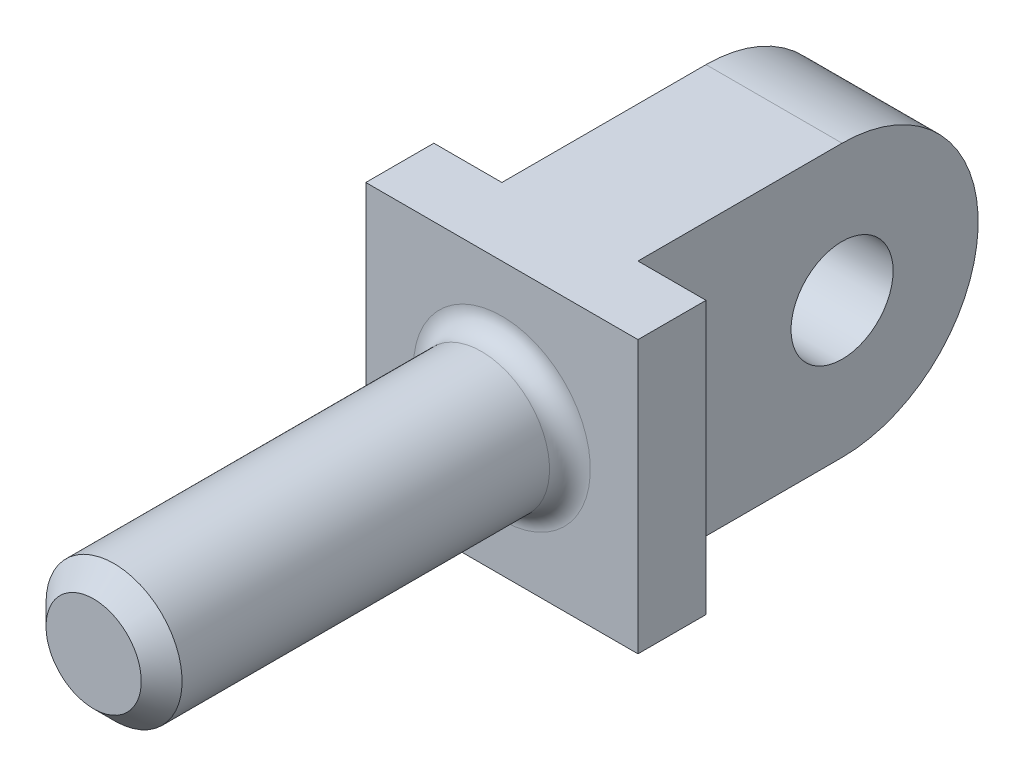
ISO-10303-21;
HEADER;
FILE_DESCRIPTION(('STEP AP214'),'2;1');
FILE_NAME('part.step','',(''),(''),'','','');
FILE_SCHEMA(('AUTOMOTIVE_DESIGN { 1 0 10303 214 1 1 1 1 }'));
ENDSEC;
DATA;
#1=APPLICATION_CONTEXT('core data for automotive mechanical design processes');
#2=APPLICATION_PROTOCOL_DEFINITION('international standard','automotive_design',2000,#1);
#3=PRODUCT_CONTEXT('',#1,'mechanical');
#4=PRODUCT('Part','Part','',(#3));
#5=PRODUCT_RELATED_PRODUCT_CATEGORY('part','',(#4));
#6=PRODUCT_DEFINITION_FORMATION('','',#4);
#7=PRODUCT_DEFINITION_CONTEXT('part definition',#1,'design');
#8=PRODUCT_DEFINITION('design','',#6,#7);
#9=PRODUCT_DEFINITION_SHAPE('','',#8);
#10=(LENGTH_UNIT() NAMED_UNIT(*) SI_UNIT(.MILLI.,.METRE.));
#11=(NAMED_UNIT(*) PLANE_ANGLE_UNIT() SI_UNIT($,.RADIAN.));
#12=(NAMED_UNIT(*) SI_UNIT($,.STERADIAN.) SOLID_ANGLE_UNIT());
#13=UNCERTAINTY_MEASURE_WITH_UNIT(LENGTH_MEASURE(1.E-05),#10,'distance_accuracy_value','');
#14=(GEOMETRIC_REPRESENTATION_CONTEXT(3) GLOBAL_UNCERTAINTY_ASSIGNED_CONTEXT((#13)) GLOBAL_UNIT_ASSIGNED_CONTEXT((#10,
#11,#12)) REPRESENTATION_CONTEXT('',''));
#15=CARTESIAN_POINT('',(0.,0.,0.));
#16=DIRECTION('',(0.,0.,1.));
#17=DIRECTION('',(1.,0.,0.));
#18=AXIS2_PLACEMENT_3D('',#15,#16,#17);
#19=CARTESIAN_POINT('',(0.,0.,-12.7));
#20=DIRECTION('',(0.,0.,-1.));
#21=DIRECTION('',(-1.,0.,0.));
#22=AXIS2_PLACEMENT_3D('',#19,#20,#21);
#23=PLANE('',#22);
#24=DIRECTION('',(-1.,0.,0.));
#25=VECTOR('',#24,1.);
#26=CARTESIAN_POINT('',(-25.4,25.4,-12.7));
#27=LINE('',#26,#25);
#28=CARTESIAN_POINT('',(-12.7,25.4,-12.7));
#29=VERTEX_POINT('',#28);
#30=CARTESIAN_POINT('',(-25.4,25.4,-12.7));
#31=VERTEX_POINT('',#30);
#32=EDGE_CURVE('E2329',#29,#31,#27,.T.);
#33=ORIENTED_EDGE('',*,*,#32,.F.);
#34=DIRECTION('',(0.,-1.,0.));
#35=VECTOR('',#34,1.);
#36=CARTESIAN_POINT('',(-12.7,25.4,-12.7));
#37=LINE('',#36,#35);
#38=CARTESIAN_POINT('',(-12.7,-25.4,-12.7));
#39=VERTEX_POINT('',#38);
#40=EDGE_CURVE('E2425',#29,#39,#37,.T.);
#41=ORIENTED_EDGE('',*,*,#40,.T.);
#42=DIRECTION('',(1.,0.,0.));
#43=VECTOR('',#42,1.);
#44=CARTESIAN_POINT('',(-25.4,-25.4,-12.7));
#45=LINE('',#44,#43);
#46=CARTESIAN_POINT('',(-25.4,-25.4,-12.7));
#47=VERTEX_POINT('',#46);
#48=EDGE_CURVE('E2389',#47,#39,#45,.T.);
#49=ORIENTED_EDGE('',*,*,#48,.F.);
#50=DIRECTION('',(0.,-1.,0.));
#51=VECTOR('',#50,1.);
#52=CARTESIAN_POINT('',(-25.4,-25.4,-12.7));
#53=LINE('',#52,#51);
#54=EDGE_CURVE('E2386',#31,#47,#53,.T.);
#55=ORIENTED_EDGE('',*,*,#54,.F.);
#56=EDGE_LOOP('',(#33,#41,#49,#55));
#57=FACE_BOUND('',#56,.T.);
#58=ADVANCED_FACE('F2314',(#57),#23,.T.);
#59=CARTESIAN_POINT('',(25.4,-25.4,-12.7));
#60=DIRECTION('',(1.,0.,0.));
#61=DIRECTION('',(0.,0.,-1.));
#62=AXIS2_PLACEMENT_3D('',#59,#60,#61);
#63=PLANE('',#62);
#64=DIRECTION('',(0.,1.,0.));
#65=VECTOR('',#64,1.);
#66=CARTESIAN_POINT('',(25.4,-25.4,0.));
#67=LINE('',#66,#65);
#68=CARTESIAN_POINT('',(25.4,-25.4,0.));
#69=VERTEX_POINT('',#68);
#70=CARTESIAN_POINT('',(25.4,25.4,0.));
#71=VERTEX_POINT('',#70);
#72=EDGE_CURVE('E2437',#69,#71,#67,.T.);
#73=ORIENTED_EDGE('',*,*,#72,.F.);
#74=DIRECTION('',(0.,0.,1.));
#75=VECTOR('',#74,1.);
#76=CARTESIAN_POINT('',(25.4,-25.4,-12.7));
#77=LINE('',#76,#75);
#78=CARTESIAN_POINT('',(25.4,-25.4,-12.7));
#79=VERTEX_POINT('',#78);
#80=EDGE_CURVE('E2463',#79,#69,#77,.T.);
#81=ORIENTED_EDGE('',*,*,#80,.F.);
#82=DIRECTION('',(0.,1.,0.));
#83=VECTOR('',#82,1.);
#84=CARTESIAN_POINT('',(25.4,-25.4,-12.7));
#85=LINE('',#84,#83);
#86=CARTESIAN_POINT('',(25.4,25.4,-12.7));
#87=VERTEX_POINT('',#86);
#88=EDGE_CURVE('E2385',#79,#87,#85,.T.);
#89=ORIENTED_EDGE('',*,*,#88,.T.);
#90=DIRECTION('',(0.,0.,1.));
#91=VECTOR('',#90,1.);
#92=CARTESIAN_POINT('',(25.4,25.4,-12.7));
#93=LINE('',#92,#91);
#94=EDGE_CURVE('E2448',#87,#71,#93,.T.);
#95=ORIENTED_EDGE('',*,*,#94,.T.);
#96=EDGE_LOOP('',(#73,#81,#89,#95));
#97=FACE_BOUND('',#96,.T.);
#98=ADVANCED_FACE('F2498',(#97),#63,.T.);
#99=CARTESIAN_POINT('',(-25.4,-25.4,-12.7));
#100=DIRECTION('',(0.,-1.,0.));
#101=DIRECTION('',(0.,0.,-1.));
#102=AXIS2_PLACEMENT_3D('',#99,#100,#101);
#103=PLANE('',#102);
#104=DIRECTION('',(1.,0.,0.));
#105=VECTOR('',#104,1.);
#106=CARTESIAN_POINT('',(-25.4,-25.4,0.));
#107=LINE('',#106,#105);
#108=CARTESIAN_POINT('',(-25.4,-25.4,0.));
#109=VERTEX_POINT('',#108);
#110=EDGE_CURVE('E2439',#109,#69,#107,.T.);
#111=ORIENTED_EDGE('',*,*,#110,.F.);
#112=DIRECTION('',(0.,0.,1.));
#113=VECTOR('',#112,1.);
#114=CARTESIAN_POINT('',(-25.4,-25.4,-12.7));
#115=LINE('',#114,#113);
#116=EDGE_CURVE('E2470',#47,#109,#115,.T.);
#117=ORIENTED_EDGE('',*,*,#116,.F.);
#118=ORIENTED_EDGE('',*,*,#48,.T.);
#119=DIRECTION('',(0.,0.,-1.));
#120=VECTOR('',#119,1.);
#121=CARTESIAN_POINT('',(-12.7,-25.4,-12.7));
#122=LINE('',#121,#120);
#123=CARTESIAN_POINT('',(-12.7,-25.4,-50.8));
#124=VERTEX_POINT('',#123);
#125=EDGE_CURVE('E2423',#39,#124,#122,.T.);
#126=ORIENTED_EDGE('',*,*,#125,.T.);
#127=DIRECTION('',(-1.,0.,0.));
#128=VECTOR('',#127,1.);
#129=CARTESIAN_POINT('',(12.7,-25.4,-50.8));
#130=LINE('',#129,#128);
#131=CARTESIAN_POINT('',(12.7,-25.4,-50.8));
#132=VERTEX_POINT('',#131);
#133=EDGE_CURVE('E2394',#132,#124,#130,.T.);
#134=ORIENTED_EDGE('',*,*,#133,.F.);
#135=DIRECTION('',(0.,0.,-1.));
#136=VECTOR('',#135,1.);
#137=CARTESIAN_POINT('',(12.7,-25.4,-12.7));
#138=LINE('',#137,#136);
#139=CARTESIAN_POINT('',(12.7,-25.4,-12.7));
#140=VERTEX_POINT('',#139);
#141=EDGE_CURVE('E2387',#140,#132,#138,.T.);
#142=ORIENTED_EDGE('',*,*,#141,.F.);
#143=EDGE_CURVE('E2378',#140,#79,#45,.T.);
#144=ORIENTED_EDGE('',*,*,#143,.T.);
#145=ORIENTED_EDGE('',*,*,#80,.T.);
#146=EDGE_LOOP('',(#111,#117,#118,#126,#134,#142,#144,#145));
#147=FACE_BOUND('',#146,.T.);
#148=ADVANCED_FACE('F2395',(#147),#103,.T.);
#149=CARTESIAN_POINT('',(-25.4,-25.4,-12.7));
#150=DIRECTION('',(-1.,0.,0.));
#151=DIRECTION('',(0.,0.,1.));
#152=AXIS2_PLACEMENT_3D('',#149,#150,#151);
#153=PLANE('',#152);
#154=DIRECTION('',(0.,-1.,0.));
#155=VECTOR('',#154,1.);
#156=CARTESIAN_POINT('',(-25.4,-25.4,0.));
#157=LINE('',#156,#155);
#158=CARTESIAN_POINT('',(-25.4,25.4,0.));
#159=VERTEX_POINT('',#158);
#160=EDGE_CURVE('E2458',#159,#109,#157,.T.);
#161=ORIENTED_EDGE('',*,*,#160,.F.);
#162=DIRECTION('',(0.,0.,1.));
#163=VECTOR('',#162,1.);
#164=CARTESIAN_POINT('',(-25.4,25.4,-12.7));
#165=LINE('',#164,#163);
#166=EDGE_CURVE('E2469',#31,#159,#165,.T.);
#167=ORIENTED_EDGE('',*,*,#166,.F.);
#168=ORIENTED_EDGE('',*,*,#54,.T.);
#169=ORIENTED_EDGE('',*,*,#116,.T.);
#170=EDGE_LOOP('',(#161,#167,#168,#169));
#171=FACE_BOUND('',#170,.T.);
#172=ADVANCED_FACE('F2520',(#171),#153,.T.);
#173=CARTESIAN_POINT('',(-25.4,25.4,-12.7));
#174=DIRECTION('',(0.,1.,0.));
#175=DIRECTION('',(0.,0.,1.));
#176=AXIS2_PLACEMENT_3D('',#173,#174,#175);
#177=PLANE('',#176);
#178=DIRECTION('',(-1.,0.,0.));
#179=VECTOR('',#178,1.);
#180=CARTESIAN_POINT('',(-25.4,25.4,0.));
#181=LINE('',#180,#179);
#182=EDGE_CURVE('E2452',#71,#159,#181,.T.);
#183=ORIENTED_EDGE('',*,*,#182,.F.);
#184=ORIENTED_EDGE('',*,*,#94,.F.);
#185=CARTESIAN_POINT('',(12.7,25.4,-12.7));
#186=VERTEX_POINT('',#185);
#187=EDGE_CURVE('E2438',#87,#186,#27,.T.);
#188=ORIENTED_EDGE('',*,*,#187,.T.);
#189=DIRECTION('',(0.,0.,1.));
#190=VECTOR('',#189,1.);
#191=CARTESIAN_POINT('',(12.7,25.4,-12.7));
#192=LINE('',#191,#190);
#193=CARTESIAN_POINT('',(12.7,25.4,-50.8));
#194=VERTEX_POINT('',#193);
#195=EDGE_CURVE('E2404',#194,#186,#192,.T.);
#196=ORIENTED_EDGE('',*,*,#195,.F.);
#197=DIRECTION('',(-1.,0.,0.));
#198=VECTOR('',#197,1.);
#199=CARTESIAN_POINT('',(12.7,25.4,-50.8));
#200=LINE('',#199,#198);
#201=CARTESIAN_POINT('',(-12.7,25.4,-50.8));
#202=VERTEX_POINT('',#201);
#203=EDGE_CURVE('E2422',#194,#202,#200,.T.);
#204=ORIENTED_EDGE('',*,*,#203,.T.);
#205=DIRECTION('',(0.,0.,1.));
#206=VECTOR('',#205,1.);
#207=CARTESIAN_POINT('',(-12.7,25.4,-12.7));
#208=LINE('',#207,#206);
#209=EDGE_CURVE('E2406',#202,#29,#208,.T.);
#210=ORIENTED_EDGE('',*,*,#209,.T.);
#211=ORIENTED_EDGE('',*,*,#32,.T.);
#212=ORIENTED_EDGE('',*,*,#166,.T.);
#213=EDGE_LOOP('',(#183,#184,#188,#196,#204,#210,#211,#212));
#214=FACE_BOUND('',#213,.T.);
#215=ADVANCED_FACE('F2509',(#214),#177,.T.);
#216=DIRECTION('',(0.,-1.,0.));
#217=VECTOR('',#216,1.);
#218=CARTESIAN_POINT('',(12.7,25.4,-12.7));
#219=LINE('',#218,#217);
#220=EDGE_CURVE('E2340',#186,#140,#219,.T.);
#221=ORIENTED_EDGE('',*,*,#220,.F.);
#222=ORIENTED_EDGE('',*,*,#187,.F.);
#223=ORIENTED_EDGE('',*,*,#88,.F.);
#224=ORIENTED_EDGE('',*,*,#143,.F.);
#225=EDGE_LOOP('',(#221,#222,#223,#224));
#226=FACE_BOUND('',#225,.T.);
#227=ADVANCED_FACE('F2379',(#226),#23,.T.);
#228=CARTESIAN_POINT('',(0.,0.,0.));
#229=DIRECTION('',(0.,0.,-1.));
#230=DIRECTION('',(-1.,0.,0.));
#231=AXIS2_PLACEMENT_3D('',#228,#229,#230);
#232=PLANE('',#231);
#233=CARTESIAN_POINT('',(0.,0.,0.));
#234=DIRECTION('',(0.,0.,-1.));
#235=DIRECTION('',(-1.,0.,0.));
#236=AXIS2_PLACEMENT_3D('',#233,#234,#235);
#237=CIRCLE('',#236,16.51);
#238=CARTESIAN_POINT('',(-16.51,0.,0.));
#239=VERTEX_POINT('',#238);
#240=EDGE_CURVE('E2479',#239,#239,#237,.T.);
#241=ORIENTED_EDGE('',*,*,#240,.T.);
#242=EDGE_LOOP('',(#241));
#243=FACE_BOUND('',#242,.T.);
#244=ORIENTED_EDGE('',*,*,#72,.T.);
#245=ORIENTED_EDGE('',*,*,#182,.T.);
#246=ORIENTED_EDGE('',*,*,#160,.T.);
#247=ORIENTED_EDGE('',*,*,#110,.T.);
#248=EDGE_LOOP('',(#244,#245,#246,#247));
#249=FACE_BOUND('',#248,.T.);
#250=ADVANCED_FACE('F2510',(#243,#249),#232,.F.);
#251=CARTESIAN_POINT('',(0.,0.,76.2));
#252=DIRECTION('',(0.,0.,-1.));
#253=DIRECTION('',(-1.,0.,0.));
#254=AXIS2_PLACEMENT_3D('',#251,#252,#253);
#255=CYLINDRICAL_SURFACE('',#254,12.7);
#256=CARTESIAN_POINT('',(0.,0.,72.3900000000001));
#257=DIRECTION('',(0.,0.,1.));
#258=DIRECTION('',(1.,0.,0.));
#259=AXIS2_PLACEMENT_3D('',#256,#257,#258);
#260=CIRCLE('',#259,12.7);
#261=CARTESIAN_POINT('',(-12.7,0.,72.3900000000001));
#262=VERTEX_POINT('',#261);
#263=EDGE_CURVE('E12',#262,#262,#260,.F.);
#264=CARTESIAN_POINT('',(0.,0.,3.80999999999999));
#265=DIRECTION('',(0.,0.,-1.));
#266=DIRECTION('',(-1.,0.,0.));
#267=AXIS2_PLACEMENT_3D('',#264,#265,#266);
#268=CIRCLE('',#267,12.7);
#269=CARTESIAN_POINT('',(-12.7,0.,3.81000000000001));
#270=VERTEX_POINT('',#269);
#271=EDGE_CURVE('E2466',#270,#270,#268,.F.);
#272=CARTESIAN_POINT('',(-12.7,0.,72.3900000000001));
#273=CARTESIAN_POINT('',(-12.7,0.,71.6756250000001));
#274=CARTESIAN_POINT('',(-12.7,0.,70.9612500000001));
#275=CARTESIAN_POINT('',(-12.7,0.,69.5325000000001));
#276=CARTESIAN_POINT('',(-12.7,0.,68.8181250000001));
#277=CARTESIAN_POINT('',(-12.7,0.,67.3893750000001));
#278=CARTESIAN_POINT('',(-12.7,0.,66.6750000000001));
#279=CARTESIAN_POINT('',(-12.7,0.,65.2462500000001));
#280=CARTESIAN_POINT('',(-12.7,0.,64.5318750000001));
#281=CARTESIAN_POINT('',(-12.7,0.,63.1031250000001));
#282=CARTESIAN_POINT('',(-12.7,0.,62.3887500000001));
#283=CARTESIAN_POINT('',(-12.7,0.,60.9600000000001));
#284=CARTESIAN_POINT('',(-12.7,0.,60.2456250000001));
#285=CARTESIAN_POINT('',(-12.7,0.,58.8168750000001));
#286=CARTESIAN_POINT('',(-12.7,0.,58.1025000000001));
#287=CARTESIAN_POINT('',(-12.7,0.,56.6737500000001));
#288=CARTESIAN_POINT('',(-12.7,0.,55.9593750000001));
#289=CARTESIAN_POINT('',(-12.7,0.,54.5306250000001));
#290=CARTESIAN_POINT('',(-12.7,0.,53.8162500000001));
#291=CARTESIAN_POINT('',(-12.7,0.,52.3875000000001));
#292=CARTESIAN_POINT('',(-12.7,0.,51.673125));
#293=CARTESIAN_POINT('',(-12.7,0.,50.244375));
#294=CARTESIAN_POINT('',(-12.7,0.,49.53));
#295=CARTESIAN_POINT('',(-12.7,0.,48.1012500000001));
#296=CARTESIAN_POINT('',(-12.7,0.,47.386875));
#297=CARTESIAN_POINT('',(-12.7,0.,45.958125));
#298=CARTESIAN_POINT('',(-12.7,0.,45.24375));
#299=CARTESIAN_POINT('',(-12.7,0.,43.815));
#300=CARTESIAN_POINT('',(-12.7,0.,43.100625));
#301=CARTESIAN_POINT('',(-12.7,0.,41.671875));
#302=CARTESIAN_POINT('',(-12.7,0.,40.9575));
#303=CARTESIAN_POINT('',(-12.7,0.,39.52875));
#304=CARTESIAN_POINT('',(-12.7,0.,38.814375));
#305=CARTESIAN_POINT('',(-12.7,0.,37.385625));
#306=CARTESIAN_POINT('',(-12.7,0.,36.67125));
#307=CARTESIAN_POINT('',(-12.7,0.,35.2425));
#308=CARTESIAN_POINT('',(-12.7,0.,34.528125));
#309=CARTESIAN_POINT('',(-12.7,0.,33.099375));
#310=CARTESIAN_POINT('',(-12.7,0.,32.385));
#311=CARTESIAN_POINT('',(-12.7,0.,30.95625));
#312=CARTESIAN_POINT('',(-12.7,0.,30.241875));
#313=CARTESIAN_POINT('',(-12.7,0.,28.813125));
#314=CARTESIAN_POINT('',(-12.7,0.,28.09875));
#315=CARTESIAN_POINT('',(-12.7,0.,26.67));
#316=CARTESIAN_POINT('',(-12.7,0.,25.955625));
#317=CARTESIAN_POINT('',(-12.7,0.,24.526875));
#318=CARTESIAN_POINT('',(-12.7,0.,23.8125));
#319=CARTESIAN_POINT('',(-12.7,0.,22.38375));
#320=CARTESIAN_POINT('',(-12.7,0.,21.669375));
#321=CARTESIAN_POINT('',(-12.7,0.,20.240625));
#322=CARTESIAN_POINT('',(-12.7,0.,19.52625));
#323=CARTESIAN_POINT('',(-12.7,0.,18.0975));
#324=CARTESIAN_POINT('',(-12.7,0.,17.383125));
#325=CARTESIAN_POINT('',(-12.7,0.,15.954375));
#326=CARTESIAN_POINT('',(-12.7,0.,15.24));
#327=CARTESIAN_POINT('',(-12.7,0.,13.81125));
#328=CARTESIAN_POINT('',(-12.7,0.,13.096875));
#329=CARTESIAN_POINT('',(-12.7,0.,11.668125));
#330=CARTESIAN_POINT('',(-12.7,0.,10.95375));
#331=CARTESIAN_POINT('',(-12.7,0.,9.52500000000001));
#332=CARTESIAN_POINT('',(-12.7,0.,8.810625));
#333=CARTESIAN_POINT('',(-12.7,0.,7.381875));
#334=CARTESIAN_POINT('',(-12.7,0.,6.6675));
#335=CARTESIAN_POINT('',(-12.7,0.,5.23875000000001));
#336=CARTESIAN_POINT('',(-12.7,0.,4.52437500000001));
#337=CARTESIAN_POINT('',(-12.7,0.,3.81000000000001));
#338=B_SPLINE_CURVE_WITH_KNOTS('',3,(#272,#273,#274,#275,#276,#277,#278,#279,#280,#281,#282,
#283,#284,#285,#286,#287,#288,#289,#290,#291,#292,#293,#294,#295,#296,#297,#298,#299,#300,#301,
#302,#303,#304,#305,#306,#307,#308,#309,#310,#311,#312,#313,#314,#315,#316,#317,#318,#319,#320,
#321,#322,#323,#324,#325,#326,#327,#328,#329,#330,#331,#332,#333,#334,#335,#336,#337),
.UNSPECIFIED.,.F.,.F.,(4,2,2,2,2,2,2,2,2,2,2,2,2,2,2,2,2,2,2,2,2,2,2,2,2,2,2,2,2,2,2,2,4),(0.,
2.14312500000001,4.28625000000001,6.42937500000001,8.57250000000001,10.715625,12.85875,
15.001875,17.145,19.288125,21.43125,23.574375,25.7175,27.860625,30.00375,32.146875,34.29,
36.433125,38.5762500000001,40.719375,42.8625000000001,45.0056250000001,47.1487500000001,
49.2918750000001,51.4350000000001,53.5781250000001,55.7212500000001,57.8643750000001,
60.0075000000001,62.1506250000001,64.2937500000001,66.4368750000001,68.5800000000001),.UNSPECIFIED.);
#339=EDGE_CURVE('BSEAM2512',#262,#270,#338,.T.);
#340=ORIENTED_EDGE('',*,*,#263,.T.);
#341=ORIENTED_EDGE('',*,*,#271,.T.);
#342=ORIENTED_EDGE('',*,*,#339,.T.);
#343=ORIENTED_EDGE('',*,*,#339,.F.);
#344=EDGE_LOOP('',(#340,#342,#341,#343));
#345=FACE_BOUND('',#344,.T.);
#346=ADVANCED_FACE('F2512',(#345),#255,.T.);
#347=CARTESIAN_POINT('',(0.,0.,76.2));
#348=DIRECTION('',(0.,0.,1.));
#349=DIRECTION('',(1.,0.,0.));
#350=AXIS2_PLACEMENT_3D('',#347,#348,#349);
#351=PLANE('',#350);
#352=CARTESIAN_POINT('',(0.,0.,76.2));
#353=DIRECTION('',(0.,0.,1.));
#354=DIRECTION('',(1.,0.,0.));
#355=AXIS2_PLACEMENT_3D('',#352,#353,#354);
#356=CIRCLE('',#355,8.89000000000009);
#357=CARTESIAN_POINT('',(-8.8900000000001,0.,76.2));
#358=VERTEX_POINT('',#357);
#359=EDGE_CURVE('E2325',#358,#358,#356,.T.);
#360=ORIENTED_EDGE('',*,*,#359,.T.);
#361=EDGE_LOOP('',(#360));
#362=FACE_BOUND('',#361,.T.);
#363=ADVANCED_FACE('F2490',(#362),#351,.T.);
#364=CARTESIAN_POINT('',(12.7,0.,-50.8));
#365=DIRECTION('',(1.,0.,0.));
#366=DIRECTION('',(0.,0.,-1.));
#367=AXIS2_PLACEMENT_3D('',#364,#365,#366);
#368=PLANE('',#367);
#369=ORIENTED_EDGE('',*,*,#220,.T.);
#370=ORIENTED_EDGE('',*,*,#141,.T.);
#371=CARTESIAN_POINT('',(12.7,0.,-50.8));
#372=DIRECTION('',(1.,0.,0.));
#373=DIRECTION('',(0.,0.,-1.));
#374=AXIS2_PLACEMENT_3D('',#371,#372,#373);
#375=CIRCLE('',#374,25.4);
#376=EDGE_CURVE('E2396',#132,#194,#375,.T.);
#377=ORIENTED_EDGE('',*,*,#376,.T.);
#378=ORIENTED_EDGE('',*,*,#195,.T.);
#379=EDGE_LOOP('',(#369,#370,#377,#378));
#380=FACE_BOUND('',#379,.T.);
#381=CARTESIAN_POINT('',(12.7,0.,-50.8));
#382=DIRECTION('',(1.,0.,0.));
#383=DIRECTION('',(0.,0.,-1.));
#384=AXIS2_PLACEMENT_3D('',#381,#382,#383);
#385=CIRCLE('',#384,9.525);
#386=CARTESIAN_POINT('',(12.7,0.,-60.325));
#387=VERTEX_POINT('',#386);
#388=EDGE_CURVE('E2426',#387,#387,#385,.T.);
#389=ORIENTED_EDGE('',*,*,#388,.F.);
#390=EDGE_LOOP('',(#389));
#391=FACE_BOUND('',#390,.T.);
#392=ADVANCED_FACE('F2403',(#380,#391),#368,.T.);
#393=CARTESIAN_POINT('',(-12.7,0.,-50.8));
#394=DIRECTION('',(1.,0.,0.));
#395=DIRECTION('',(0.,0.,-1.));
#396=AXIS2_PLACEMENT_3D('',#393,#394,#395);
#397=PLANE('',#396);
#398=ORIENTED_EDGE('',*,*,#40,.F.);
#399=ORIENTED_EDGE('',*,*,#209,.F.);
#400=CARTESIAN_POINT('',(-12.7,0.,-50.8));
#401=DIRECTION('',(1.,0.,0.));
#402=DIRECTION('',(0.,0.,-1.));
#403=AXIS2_PLACEMENT_3D('',#400,#401,#402);
#404=CIRCLE('',#403,25.4);
#405=EDGE_CURVE('E2411',#124,#202,#404,.T.);
#406=ORIENTED_EDGE('',*,*,#405,.F.);
#407=ORIENTED_EDGE('',*,*,#125,.F.);
#408=EDGE_LOOP('',(#398,#399,#406,#407));
#409=FACE_BOUND('',#408,.T.);
#410=CARTESIAN_POINT('',(-12.7,0.,-50.8));
#411=DIRECTION('',(1.,0.,0.));
#412=DIRECTION('',(0.,0.,-1.));
#413=AXIS2_PLACEMENT_3D('',#410,#411,#412);
#414=CIRCLE('',#413,9.525);
#415=CARTESIAN_POINT('',(-12.7,0.,-60.325));
#416=VERTEX_POINT('',#415);
#417=EDGE_CURVE('E2412',#416,#416,#414,.T.);
#418=ORIENTED_EDGE('',*,*,#417,.T.);
#419=EDGE_LOOP('',(#418));
#420=FACE_BOUND('',#419,.T.);
#421=ADVANCED_FACE('F2567',(#409,#420),#397,.F.);
#422=CARTESIAN_POINT('',(12.7,0.,-50.8));
#423=DIRECTION('',(-1.,0.,0.));
#424=DIRECTION('',(0.,0.,1.));
#425=AXIS2_PLACEMENT_3D('',#422,#423,#424);
#426=CYLINDRICAL_SURFACE('',#425,25.4);
#427=ORIENTED_EDGE('',*,*,#405,.T.);
#428=ORIENTED_EDGE('',*,*,#203,.F.);
#429=ORIENTED_EDGE('',*,*,#376,.F.);
#430=ORIENTED_EDGE('',*,*,#133,.T.);
#431=EDGE_LOOP('',(#427,#428,#429,#430));
#432=FACE_BOUND('',#431,.T.);
#433=ADVANCED_FACE('F2578',(#432),#426,.T.);
#434=CARTESIAN_POINT('',(12.7,0.,-50.8));
#435=DIRECTION('',(-1.,0.,0.));
#436=DIRECTION('',(0.,0.,1.));
#437=AXIS2_PLACEMENT_3D('',#434,#435,#436);
#438=CYLINDRICAL_SURFACE('',#437,9.525);
#439=ORIENTED_EDGE('',*,*,#388,.T.);
#440=EDGE_LOOP('',(#439));
#441=FACE_BOUND('',#440,.T.);
#442=ORIENTED_EDGE('',*,*,#417,.F.);
#443=EDGE_LOOP('',(#442));
#444=FACE_BOUND('',#443,.T.);
#445=ADVANCED_FACE('F2493',(#441,#444),#438,.F.);
#446=CARTESIAN_POINT('',(0.,0.,3.80999999999999));
#447=DIRECTION('',(0.,0.,-1.));
#448=DIRECTION('',(-1.,0.,0.));
#449=AXIS2_PLACEMENT_3D('',#446,#447,#448);
#450=TOROIDAL_SURFACE('',#449,16.51,3.81);
#451=ORIENTED_EDGE('',*,*,#240,.F.);
#452=EDGE_LOOP('',(#451));
#453=FACE_BOUND('',#452,.T.);
#454=ORIENTED_EDGE('',*,*,#271,.F.);
#455=EDGE_LOOP('',(#454));
#456=FACE_BOUND('',#455,.T.);
#457=ADVANCED_FACE('F2489',(#453,#456),#450,.F.);
#458=CARTESIAN_POINT('',(0.,0.,76.2));
#459=DIRECTION('',(0.,0.,-1.));
#460=DIRECTION('',(-1.,0.,0.));
#461=AXIS2_PLACEMENT_3D('',#458,#459,#460);
#462=CONICAL_SURFACE('',#461,8.89000000000009,0.785398163397446);
#463=CARTESIAN_POINT('',(-12.7,0.,72.3900000000001));
#464=CARTESIAN_POINT('',(-12.6603125,0.,72.4296875000001));
#465=CARTESIAN_POINT('',(-12.620625,0.,72.4693750000001));
#466=CARTESIAN_POINT('',(-12.54125,0.,72.5487500000001));
#467=CARTESIAN_POINT('',(-12.5015625,0.,72.5884375000001));
#468=CARTESIAN_POINT('',(-12.4221875,0.,72.6678125000001));
#469=CARTESIAN_POINT('',(-12.3825,0.,72.7075000000001));
#470=CARTESIAN_POINT('',(-12.303125,0.,72.7868750000001));
#471=CARTESIAN_POINT('',(-12.2634375,0.,72.8265625000001));
#472=CARTESIAN_POINT('',(-12.1840625,0.,72.9059375000001));
#473=CARTESIAN_POINT('',(-12.144375,0.,72.9456250000001));
#474=CARTESIAN_POINT('',(-12.065,0.,73.0250000000001));
#475=CARTESIAN_POINT('',(-12.0253125,0.,73.0646875000001));
#476=CARTESIAN_POINT('',(-11.9459375,0.,73.1440625));
#477=CARTESIAN_POINT('',(-11.90625,0.,73.1837500000001));
#478=CARTESIAN_POINT('',(-11.826875,0.,73.2631250000001));
#479=CARTESIAN_POINT('',(-11.7871875,0.,73.3028125000001));
#480=CARTESIAN_POINT('',(-11.7078125,0.,73.3821875000001));
#481=CARTESIAN_POINT('',(-11.668125,0.,73.4218750000001));
#482=CARTESIAN_POINT('',(-11.58875,0.,73.50125));
#483=CARTESIAN_POINT('',(-11.5490625,0.,73.5409375000001));
#484=CARTESIAN_POINT('',(-11.4696875,0.,73.6203125000001));
#485=CARTESIAN_POINT('',(-11.43,0.,73.66));
#486=CARTESIAN_POINT('',(-11.350625,0.,73.739375));
#487=CARTESIAN_POINT('',(-11.3109375,0.,73.7790625000001));
#488=CARTESIAN_POINT('',(-11.2315625,0.,73.8584375));
#489=CARTESIAN_POINT('',(-11.191875,0.,73.8981250000001));
#490=CARTESIAN_POINT('',(-11.1125,0.,73.9775));
#491=CARTESIAN_POINT('',(-11.0728125,0.,74.0171875));
#492=CARTESIAN_POINT('',(-10.9934375,0.,74.0965625));
#493=CARTESIAN_POINT('',(-10.95375,0.,74.13625));
#494=CARTESIAN_POINT('',(-10.8743750000001,0.,74.215625));
#495=CARTESIAN_POINT('',(-10.8346875000001,0.,74.2553125));
#496=CARTESIAN_POINT('',(-10.7553125000001,0.,74.3346875));
#497=CARTESIAN_POINT('',(-10.7156250000001,0.,74.374375));
#498=CARTESIAN_POINT('',(-10.6362500000001,0.,74.45375));
#499=CARTESIAN_POINT('',(-10.5965625000001,0.,74.4934375));
#500=CARTESIAN_POINT('',(-10.5171875000001,0.,74.5728125));
#501=CARTESIAN_POINT('',(-10.4775000000001,0.,74.6125));
#502=CARTESIAN_POINT('',(-10.3981250000001,0.,74.691875));
#503=CARTESIAN_POINT('',(-10.3584375000001,0.,74.7315625));
#504=CARTESIAN_POINT('',(-10.2790625000001,0.,74.8109375));
#505=CARTESIAN_POINT('',(-10.2393750000001,0.,74.850625));
#506=CARTESIAN_POINT('',(-10.1600000000001,0.,74.93));
#507=CARTESIAN_POINT('',(-10.1203125000001,0.,74.9696875));
#508=CARTESIAN_POINT('',(-10.0409375000001,0.,75.0490625));
#509=CARTESIAN_POINT('',(-10.0012500000001,0.,75.08875));
#510=CARTESIAN_POINT('',(-9.92187500000007,0.,75.168125));
#511=CARTESIAN_POINT('',(-9.88218750000008,0.,75.2078125));
#512=CARTESIAN_POINT('',(-9.80281250000008,0.,75.2871875));
#513=CARTESIAN_POINT('',(-9.76312500000008,0.,75.326875));
#514=CARTESIAN_POINT('',(-9.68375000000008,0.,75.40625));
#515=CARTESIAN_POINT('',(-9.64406250000008,0.,75.4459375));
#516=CARTESIAN_POINT('',(-9.56468750000008,0.,75.5253125));
#517=CARTESIAN_POINT('',(-9.52500000000008,0.,75.565));
#518=CARTESIAN_POINT('',(-9.44562500000008,0.,75.644375));
#519=CARTESIAN_POINT('',(-9.40593750000008,0.,75.6840625));
#520=CARTESIAN_POINT('',(-9.32656250000009,0.,75.7634375));
#521=CARTESIAN_POINT('',(-9.28687500000009,0.,75.803125));
#522=CARTESIAN_POINT('',(-9.20750000000009,0.,75.8825));
#523=CARTESIAN_POINT('',(-9.16781250000009,0.,75.9221875));
#524=CARTESIAN_POINT('',(-9.08843750000009,0.,76.0015625));
#525=CARTESIAN_POINT('',(-9.04875000000009,0.,76.04125));
#526=CARTESIAN_POINT('',(-8.9693750000001,0.,76.120625));
#527=CARTESIAN_POINT('',(-8.9296875000001,0.,76.1603125));
#528=CARTESIAN_POINT('',(-8.8900000000001,0.,76.2));
#529=B_SPLINE_CURVE_WITH_KNOTS('',3,(#463,#464,#465,#466,#467,#468,#469,#470,#471,#472,#473,
#474,#475,#476,#477,#478,#479,#480,#481,#482,#483,#484,#485,#486,#487,#488,#489,#490,#491,#492,
#493,#494,#495,#496,#497,#498,#499,#500,#501,#502,#503,#504,#505,#506,#507,#508,#509,#510,#511,
#512,#513,#514,#515,#516,#517,#518,#519,#520,#521,#522,#523,#524,#525,#526,#527,#528),
.UNSPECIFIED.,.F.,.F.,(4,2,2,2,2,2,2,2,2,2,2,2,2,2,2,2,2,2,2,2,2,2,2,2,2,2,2,2,2,2,2,2,4),(0.,
0.168379802270037,0.336759604540084,0.50513940681012,0.673519209080167,0.841899011350214,
1.01027881362025,1.1786586158903,1.34703841816034,1.51541822043038,1.68379802270043,
1.85217782497046,2.02055762724051,2.18893742951056,2.35731723178059,2.52569703405064,
2.69407683632069,2.86245663859072,3.03083644086077,3.19921624313081,3.36759604540085,
3.5359758476709,3.70435564994094,3.87273545221098,4.04111525448103,4.20949505675107,
4.37787485902111,4.54625466129115,4.7146344635612,4.88301426583125,5.05139406810128,
5.21977387037133,5.38815367264138),.UNSPECIFIED.);
#530=EDGE_CURVE('BSEAM2313',#262,#358,#529,.T.);
#531=ORIENTED_EDGE('',*,*,#263,.F.);
#532=ORIENTED_EDGE('',*,*,#359,.F.);
#533=ORIENTED_EDGE('',*,*,#530,.T.);
#534=ORIENTED_EDGE('',*,*,#530,.F.);
#535=EDGE_LOOP('',(#531,#533,#532,#534));
#536=FACE_BOUND('',#535,.T.);
#537=ADVANCED_FACE('F2313',(#536),#462,.T.);
#538=CLOSED_SHELL('',(#58,#98,#148,#172,#215,#227,#250,#346,#363,#392,#421,#433,#445,#457,#537));
#539=MANIFOLD_SOLID_BREP('B2',#538);
#540=ADVANCED_BREP_SHAPE_REPRESENTATION('',(#18,#539),#14);
#541=SHAPE_DEFINITION_REPRESENTATION(#9,#540);
ENDSEC;
END-ISO-10303-21;
